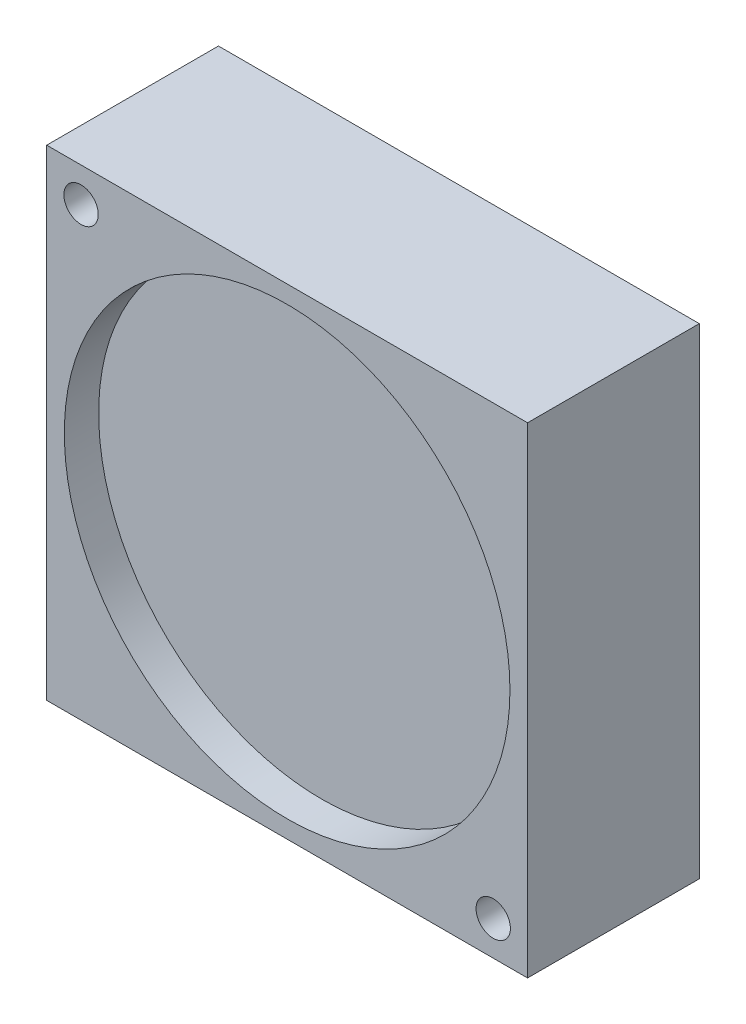
ISO-10303-21;
HEADER;
FILE_DESCRIPTION(('STEP AP214'),'2;1');
FILE_NAME('part.step','',(''),(''),'','','');
FILE_SCHEMA(('AUTOMOTIVE_DESIGN { 1 0 10303 214 1 1 1 1 }'));
ENDSEC;
DATA;
#1=APPLICATION_CONTEXT('core data for automotive mechanical design processes');
#2=APPLICATION_PROTOCOL_DEFINITION('international standard','automotive_design',2000,#1);
#3=PRODUCT_CONTEXT('',#1,'mechanical');
#4=PRODUCT('Part','Part','',(#3));
#5=PRODUCT_RELATED_PRODUCT_CATEGORY('part','',(#4));
#6=PRODUCT_DEFINITION_FORMATION('','',#4);
#7=PRODUCT_DEFINITION_CONTEXT('part definition',#1,'design');
#8=PRODUCT_DEFINITION('design','',#6,#7);
#9=PRODUCT_DEFINITION_SHAPE('','',#8);
#10=(LENGTH_UNIT() NAMED_UNIT(*) SI_UNIT(.MILLI.,.METRE.));
#11=(NAMED_UNIT(*) PLANE_ANGLE_UNIT() SI_UNIT($,.RADIAN.));
#12=(NAMED_UNIT(*) SI_UNIT($,.STERADIAN.) SOLID_ANGLE_UNIT());
#13=UNCERTAINTY_MEASURE_WITH_UNIT(LENGTH_MEASURE(1.E-05),#10,'distance_accuracy_value','');
#14=(GEOMETRIC_REPRESENTATION_CONTEXT(3) GLOBAL_UNCERTAINTY_ASSIGNED_CONTEXT((#13)) GLOBAL_UNIT_ASSIGNED_CONTEXT((#10,
#11,#12)) REPRESENTATION_CONTEXT('',''));
#15=CARTESIAN_POINT('',(0.,0.,0.));
#16=DIRECTION('',(0.,0.,1.));
#17=DIRECTION('',(1.,0.,0.));
#18=AXIS2_PLACEMENT_3D('',#15,#16,#17);
#19=CARTESIAN_POINT('',(0.,0.,10.));
#20=DIRECTION('',(0.,0.,1.));
#21=DIRECTION('',(1.,0.,0.));
#22=AXIS2_PLACEMENT_3D('',#19,#20,#21);
#23=PLANE('',#22);
#24=CARTESIAN_POINT('',(0.,0.,10.));
#25=DIRECTION('',(0.,0.,1.));
#26=DIRECTION('',(1.,0.,0.));
#27=AXIS2_PLACEMENT_3D('',#24,#25,#26);
#28=CIRCLE('',#27,12.9746796719681);
#29=CARTESIAN_POINT('',(12.9746796719681,0.,10.));
#30=VERTEX_POINT('',#29);
#31=EDGE_CURVE('E150',#30,#30,#28,.T.);
#32=ORIENTED_EDGE('',*,*,#31,.F.);
#33=EDGE_LOOP('',(#32));
#34=FACE_BOUND('',#33,.T.);
#35=CARTESIAN_POINT('',(12.,-12.,10.));
#36=DIRECTION('',(0.,0.,1.));
#37=DIRECTION('',(1.,0.,0.));
#38=AXIS2_PLACEMENT_3D('',#35,#36,#37);
#39=CIRCLE('',#38,1.);
#40=CARTESIAN_POINT('',(13.,-12.,10.));
#41=VERTEX_POINT('',#40);
#42=EDGE_CURVE('E116',#41,#41,#39,.T.);
#43=ORIENTED_EDGE('',*,*,#42,.F.);
#44=EDGE_LOOP('',(#43));
#45=FACE_BOUND('',#44,.T.);
#46=DIRECTION('',(0.,-1.,0.));
#47=VECTOR('',#46,1.);
#48=CARTESIAN_POINT('',(-14.,-14.,10.));
#49=LINE('',#48,#47);
#50=CARTESIAN_POINT('',(-14.,14.,10.));
#51=VERTEX_POINT('',#50);
#52=CARTESIAN_POINT('',(-14.,-14.,10.));
#53=VERTEX_POINT('',#52);
#54=EDGE_CURVE('E96',#51,#53,#49,.T.);
#55=ORIENTED_EDGE('',*,*,#54,.T.);
#56=DIRECTION('',(1.,0.,0.));
#57=VECTOR('',#56,1.);
#58=CARTESIAN_POINT('',(14.,-14.,10.));
#59=LINE('',#58,#57);
#60=CARTESIAN_POINT('',(14.,-14.,10.));
#61=VERTEX_POINT('',#60);
#62=EDGE_CURVE('E91',#53,#61,#59,.T.);
#63=ORIENTED_EDGE('',*,*,#62,.T.);
#64=DIRECTION('',(0.,1.,0.));
#65=VECTOR('',#64,1.);
#66=CARTESIAN_POINT('',(14.,-14.,10.));
#67=LINE('',#66,#65);
#68=CARTESIAN_POINT('',(14.,14.,10.));
#69=VERTEX_POINT('',#68);
#70=EDGE_CURVE('E94',#61,#69,#67,.T.);
#71=ORIENTED_EDGE('',*,*,#70,.T.);
#72=DIRECTION('',(-1.,0.,0.));
#73=VECTOR('',#72,1.);
#74=CARTESIAN_POINT('',(14.,14.,10.));
#75=LINE('',#74,#73);
#76=EDGE_CURVE('E61',#69,#51,#75,.T.);
#77=ORIENTED_EDGE('',*,*,#76,.T.);
#78=EDGE_LOOP('',(#55,#63,#71,#77));
#79=FACE_BOUND('',#78,.T.);
#80=CARTESIAN_POINT('',(-12.,12.,10.));
#81=DIRECTION('',(0.,0.,1.));
#82=DIRECTION('',(1.,0.,0.));
#83=AXIS2_PLACEMENT_3D('',#80,#81,#82);
#84=CIRCLE('',#83,0.999999999999999);
#85=CARTESIAN_POINT('',(-11.,12.,10.));
#86=VERTEX_POINT('',#85);
#87=EDGE_CURVE('E138',#86,#86,#84,.T.);
#88=ORIENTED_EDGE('',*,*,#87,.F.);
#89=EDGE_LOOP('',(#88));
#90=FACE_BOUND('',#89,.T.);
#91=ADVANCED_FACE('F43',(#34,#45,#79,#90),#23,.T.);
#92=CARTESIAN_POINT('',(0.,0.,0.));
#93=DIRECTION('',(0.,0.,1.));
#94=DIRECTION('',(1.,0.,0.));
#95=AXIS2_PLACEMENT_3D('',#92,#93,#94);
#96=PLANE('',#95);
#97=DIRECTION('',(0.,-1.,0.));
#98=VECTOR('',#97,1.);
#99=CARTESIAN_POINT('',(-14.,-14.,0.));
#100=LINE('',#99,#98);
#101=CARTESIAN_POINT('',(-14.,14.,0.));
#102=VERTEX_POINT('',#101);
#103=CARTESIAN_POINT('',(-14.,-14.,0.));
#104=VERTEX_POINT('',#103);
#105=EDGE_CURVE('E112',#102,#104,#100,.T.);
#106=ORIENTED_EDGE('',*,*,#105,.F.);
#107=DIRECTION('',(-1.,0.,0.));
#108=VECTOR('',#107,1.);
#109=CARTESIAN_POINT('',(14.,14.,0.));
#110=LINE('',#109,#108);
#111=CARTESIAN_POINT('',(14.,14.,0.));
#112=VERTEX_POINT('',#111);
#113=EDGE_CURVE('E84',#112,#102,#110,.T.);
#114=ORIENTED_EDGE('',*,*,#113,.F.);
#115=DIRECTION('',(0.,1.,0.));
#116=VECTOR('',#115,1.);
#117=CARTESIAN_POINT('',(14.,-14.,0.));
#118=LINE('',#117,#116);
#119=CARTESIAN_POINT('',(14.,-14.,0.));
#120=VERTEX_POINT('',#119);
#121=EDGE_CURVE('E78',#120,#112,#118,.T.);
#122=ORIENTED_EDGE('',*,*,#121,.F.);
#123=DIRECTION('',(1.,0.,0.));
#124=VECTOR('',#123,1.);
#125=CARTESIAN_POINT('',(14.,-14.,0.));
#126=LINE('',#125,#124);
#127=EDGE_CURVE('E101',#104,#120,#126,.T.);
#128=ORIENTED_EDGE('',*,*,#127,.F.);
#129=EDGE_LOOP('',(#106,#114,#122,#128));
#130=FACE_BOUND('',#129,.T.);
#131=CARTESIAN_POINT('',(12.,-12.,0.));
#132=DIRECTION('',(0.,0.,1.));
#133=DIRECTION('',(1.,0.,0.));
#134=AXIS2_PLACEMENT_3D('',#131,#132,#133);
#135=CIRCLE('',#134,1.);
#136=CARTESIAN_POINT('',(13.,-12.,0.));
#137=VERTEX_POINT('',#136);
#138=EDGE_CURVE('E134',#137,#137,#135,.T.);
#139=ORIENTED_EDGE('',*,*,#138,.T.);
#140=EDGE_LOOP('',(#139));
#141=FACE_BOUND('',#140,.T.);
#142=CARTESIAN_POINT('',(-12.,12.,0.));
#143=DIRECTION('',(0.,0.,1.));
#144=DIRECTION('',(1.,0.,0.));
#145=AXIS2_PLACEMENT_3D('',#142,#143,#144);
#146=CIRCLE('',#145,0.999999999999999);
#147=CARTESIAN_POINT('',(-11.,12.,0.));
#148=VERTEX_POINT('',#147);
#149=EDGE_CURVE('E142',#148,#148,#146,.T.);
#150=ORIENTED_EDGE('',*,*,#149,.T.);
#151=EDGE_LOOP('',(#150));
#152=FACE_BOUND('',#151,.T.);
#153=ADVANCED_FACE('F129',(#130,#141,#152),#96,.F.);
#154=CARTESIAN_POINT('',(-14.,-14.,10.));
#155=DIRECTION('',(1.,0.,0.));
#156=DIRECTION('',(0.,0.,-1.));
#157=AXIS2_PLACEMENT_3D('',#154,#155,#156);
#158=PLANE('',#157);
#159=ORIENTED_EDGE('',*,*,#105,.T.);
#160=DIRECTION('',(0.,0.,-1.));
#161=VECTOR('',#160,1.);
#162=CARTESIAN_POINT('',(-14.,-14.,10.));
#163=LINE('',#162,#161);
#164=EDGE_CURVE('E11',#53,#104,#163,.T.);
#165=ORIENTED_EDGE('',*,*,#164,.F.);
#166=ORIENTED_EDGE('',*,*,#54,.F.);
#167=DIRECTION('',(0.,0.,-1.));
#168=VECTOR('',#167,1.);
#169=CARTESIAN_POINT('',(-14.,14.,10.));
#170=LINE('',#169,#168);
#171=EDGE_CURVE('E108',#51,#102,#170,.T.);
#172=ORIENTED_EDGE('',*,*,#171,.T.);
#173=EDGE_LOOP('',(#159,#165,#166,#172));
#174=FACE_BOUND('',#173,.T.);
#175=ADVANCED_FACE('F45',(#174),#158,.F.);
#176=CARTESIAN_POINT('',(14.,-14.,10.));
#177=DIRECTION('',(0.,1.,0.));
#178=DIRECTION('',(-1.,0.,0.));
#179=AXIS2_PLACEMENT_3D('',#176,#177,#178);
#180=PLANE('',#179);
#181=ORIENTED_EDGE('',*,*,#127,.T.);
#182=DIRECTION('',(0.,0.,-1.));
#183=VECTOR('',#182,1.);
#184=CARTESIAN_POINT('',(14.,-14.,10.));
#185=LINE('',#184,#183);
#186=EDGE_CURVE('E53',#61,#120,#185,.T.);
#187=ORIENTED_EDGE('',*,*,#186,.F.);
#188=ORIENTED_EDGE('',*,*,#62,.F.);
#189=ORIENTED_EDGE('',*,*,#164,.T.);
#190=EDGE_LOOP('',(#181,#187,#188,#189));
#191=FACE_BOUND('',#190,.T.);
#192=ADVANCED_FACE('F100',(#191),#180,.F.);
#193=CARTESIAN_POINT('',(14.,-14.,10.));
#194=DIRECTION('',(-1.,0.,0.));
#195=DIRECTION('',(0.,0.,1.));
#196=AXIS2_PLACEMENT_3D('',#193,#194,#195);
#197=PLANE('',#196);
#198=ORIENTED_EDGE('',*,*,#121,.T.);
#199=DIRECTION('',(0.,0.,-1.));
#200=VECTOR('',#199,1.);
#201=CARTESIAN_POINT('',(14.,14.,10.));
#202=LINE('',#201,#200);
#203=EDGE_CURVE('E103',#69,#112,#202,.T.);
#204=ORIENTED_EDGE('',*,*,#203,.F.);
#205=ORIENTED_EDGE('',*,*,#70,.F.);
#206=ORIENTED_EDGE('',*,*,#186,.T.);
#207=EDGE_LOOP('',(#198,#204,#205,#206));
#208=FACE_BOUND('',#207,.T.);
#209=ADVANCED_FACE('F104',(#208),#197,.F.);
#210=CARTESIAN_POINT('',(14.,14.,10.));
#211=DIRECTION('',(0.,-1.,0.));
#212=DIRECTION('',(1.,0.,0.));
#213=AXIS2_PLACEMENT_3D('',#210,#211,#212);
#214=PLANE('',#213);
#215=ORIENTED_EDGE('',*,*,#113,.T.);
#216=ORIENTED_EDGE('',*,*,#171,.F.);
#217=ORIENTED_EDGE('',*,*,#76,.F.);
#218=ORIENTED_EDGE('',*,*,#203,.T.);
#219=EDGE_LOOP('',(#215,#216,#217,#218));
#220=FACE_BOUND('',#219,.T.);
#221=ADVANCED_FACE('F126',(#220),#214,.F.);
#222=CARTESIAN_POINT('',(12.,-12.,10.));
#223=DIRECTION('',(0.,0.,-1.));
#224=DIRECTION('',(-1.,0.,0.));
#225=AXIS2_PLACEMENT_3D('',#222,#223,#224);
#226=CYLINDRICAL_SURFACE('',#225,1.);
#227=ORIENTED_EDGE('',*,*,#42,.T.);
#228=EDGE_LOOP('',(#227));
#229=FACE_BOUND('',#228,.T.);
#230=ORIENTED_EDGE('',*,*,#138,.F.);
#231=EDGE_LOOP('',(#230));
#232=FACE_BOUND('',#231,.T.);
#233=ADVANCED_FACE('F172',(#229,#232),#226,.F.);
#234=CARTESIAN_POINT('',(-12.,12.,10.));
#235=DIRECTION('',(0.,0.,-1.));
#236=DIRECTION('',(-1.,0.,0.));
#237=AXIS2_PLACEMENT_3D('',#234,#235,#236);
#238=CYLINDRICAL_SURFACE('',#237,0.999999999999999);
#239=ORIENTED_EDGE('',*,*,#87,.T.);
#240=EDGE_LOOP('',(#239));
#241=FACE_BOUND('',#240,.T.);
#242=ORIENTED_EDGE('',*,*,#149,.F.);
#243=EDGE_LOOP('',(#242));
#244=FACE_BOUND('',#243,.T.);
#245=ADVANCED_FACE('F163',(#241,#244),#238,.F.);
#246=CARTESIAN_POINT('',(0.,0.,8.));
#247=DIRECTION('',(0.,0.,1.));
#248=DIRECTION('',(1.,0.,0.));
#249=AXIS2_PLACEMENT_3D('',#246,#247,#248);
#250=CYLINDRICAL_SURFACE('',#249,12.9746796719681);
#251=CARTESIAN_POINT('',(0.,0.,8.));
#252=DIRECTION('',(0.,0.,1.));
#253=DIRECTION('',(1.,0.,0.));
#254=AXIS2_PLACEMENT_3D('',#251,#252,#253);
#255=CIRCLE('',#254,12.9746796719681);
#256=CARTESIAN_POINT('',(12.9746796719681,0.,8.));
#257=VERTEX_POINT('',#256);
#258=EDGE_CURVE('E146',#257,#257,#255,.T.);
#259=ORIENTED_EDGE('',*,*,#258,.F.);
#260=EDGE_LOOP('',(#259));
#261=FACE_BOUND('',#260,.T.);
#262=ORIENTED_EDGE('',*,*,#31,.T.);
#263=EDGE_LOOP('',(#262));
#264=FACE_BOUND('',#263,.T.);
#265=ADVANCED_FACE('F160',(#261,#264),#250,.F.);
#266=CARTESIAN_POINT('',(0.,0.,8.));
#267=DIRECTION('',(0.,0.,1.));
#268=DIRECTION('',(1.,0.,0.));
#269=AXIS2_PLACEMENT_3D('',#266,#267,#268);
#270=PLANE('',#269);
#271=ORIENTED_EDGE('',*,*,#258,.T.);
#272=EDGE_LOOP('',(#271));
#273=FACE_BOUND('',#272,.T.);
#274=ADVANCED_FACE('F158',(#273),#270,.T.);
#275=CLOSED_SHELL('',(#91,#153,#175,#192,#209,#221,#233,#245,#265,#274));
#276=MANIFOLD_SOLID_BREP('B2',#275);
#277=ADVANCED_BREP_SHAPE_REPRESENTATION('',(#18,#276),#14);
#278=SHAPE_DEFINITION_REPRESENTATION(#9,#277);
ENDSEC;
END-ISO-10303-21;
